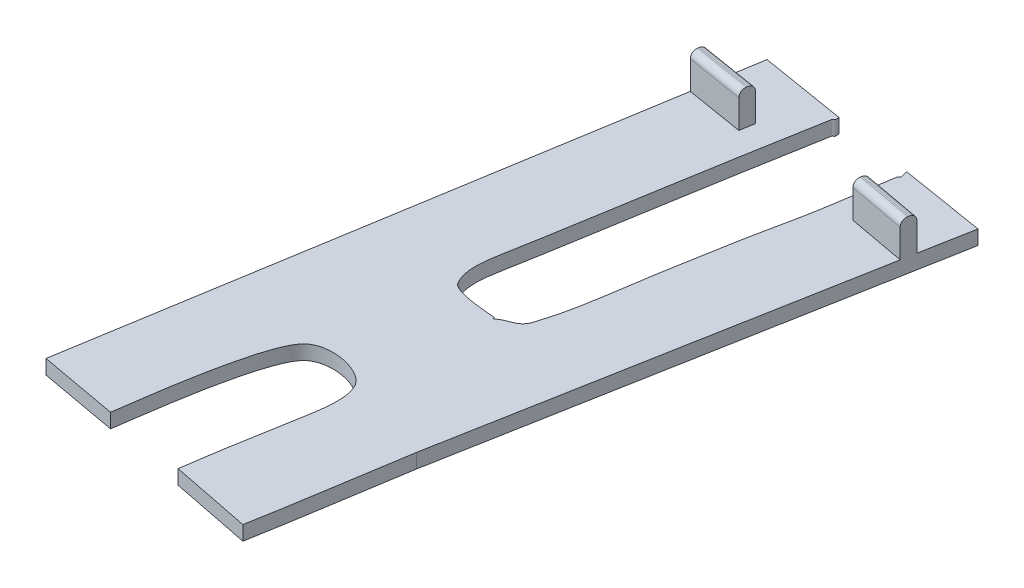
ISO-10303-21;
HEADER;
FILE_DESCRIPTION(('STEP AP214'),'2;1');
FILE_NAME('part.step','',(''),(''),'','','');
FILE_SCHEMA(('AUTOMOTIVE_DESIGN { 1 0 10303 214 1 1 1 1 }'));
ENDSEC;
DATA;
#1=APPLICATION_CONTEXT('core data for automotive mechanical design processes');
#2=APPLICATION_PROTOCOL_DEFINITION('international standard','automotive_design',2000,#1);
#3=PRODUCT_CONTEXT('',#1,'mechanical');
#4=PRODUCT('Part','Part','',(#3));
#5=PRODUCT_RELATED_PRODUCT_CATEGORY('part','',(#4));
#6=PRODUCT_DEFINITION_FORMATION('','',#4);
#7=PRODUCT_DEFINITION_CONTEXT('part definition',#1,'design');
#8=PRODUCT_DEFINITION('design','',#6,#7);
#9=PRODUCT_DEFINITION_SHAPE('','',#8);
#10=(LENGTH_UNIT() NAMED_UNIT(*) SI_UNIT(.MILLI.,.METRE.));
#11=(NAMED_UNIT(*) PLANE_ANGLE_UNIT() SI_UNIT($,.RADIAN.));
#12=(NAMED_UNIT(*) SI_UNIT($,.STERADIAN.) SOLID_ANGLE_UNIT());
#13=UNCERTAINTY_MEASURE_WITH_UNIT(LENGTH_MEASURE(1.E-05),#10,'distance_accuracy_value','');
#14=(GEOMETRIC_REPRESENTATION_CONTEXT(3) GLOBAL_UNCERTAINTY_ASSIGNED_CONTEXT((#13)) GLOBAL_UNIT_ASSIGNED_CONTEXT((#10,
#11,#12)) REPRESENTATION_CONTEXT('',''));
#15=CARTESIAN_POINT('',(0.,0.,0.));
#16=DIRECTION('',(0.,0.,1.));
#17=DIRECTION('',(1.,0.,0.));
#18=AXIS2_PLACEMENT_3D('',#15,#16,#17);
#19=CARTESIAN_POINT('',(62.4947593620138,1.,-34.1363669338565));
#20=DIRECTION('',(0.,1.,0.));
#21=DIRECTION('',(0.,0.,1.));
#22=AXIS2_PLACEMENT_3D('',#19,#20,#21);
#23=PLANE('',#22);
#24=DIRECTION('',(-0.983871023470173,0.,-0.178879314555246));
#25=VECTOR('',#24,1.);
#26=CARTESIAN_POINT('',(48.3176180526334,1.,18.5299036374429));
#27=LINE('',#26,#25);
#28=CARTESIAN_POINT('',(48.3176180526334,1.,18.5299036374429));
#29=VERTEX_POINT('',#28);
#30=CARTESIAN_POINT('',(42.8404891067724,1.,17.534097227665));
#31=VERTEX_POINT('',#30);
#32=EDGE_CURVE('E210',#29,#31,#27,.T.);
#33=ORIENTED_EDGE('',*,*,#32,.F.);
#34=CARTESIAN_POINT('',(54.0535774989014,1.,19.5728053549462));
#35=CARTESIAN_POINT('',(54.2273944518186,1.,18.4429951609843));
#36=CARTESIAN_POINT('',(54.3668816625848,1.,17.307366926429));
#37=CARTESIAN_POINT('',(54.575028357653,1.,16.1833747730606));
#38=CARTESIAN_POINT('',(54.807877915917,1.,14.9259871584352));
#39=CARTESIAN_POINT('',(55.0095707399461,1.,13.663028955761));
#40=CARTESIAN_POINT('',(55.2268419310926,1.,12.4028560471112));
#41=CARTESIAN_POINT('',(55.3933544876438,1.,11.437083219114));
#42=CARTESIAN_POINT('',(55.8006028470478,1.,9.63949643838447));
#43=CARTESIAN_POINT('',(55.2268419310926,1.,8.49197460647397));
#44=CARTESIAN_POINT('',(54.6235165071106,1.,7.28532375851014));
#45=CARTESIAN_POINT('',(51.7213412108256,1.,6.64852043130625));
#46=CARTESIAN_POINT('',(50.7945096317037,1.,7.84016103303442));
#47=CARTESIAN_POINT('',(49.3931984092304,1.,9.64184689050008));
#48=CARTESIAN_POINT('',(48.4682347935097,1.,17.6073760995754));
#49=CARTESIAN_POINT('',(48.3176180526334,1.,18.5299036374429));
#50=B_SPLINE_CURVE_WITH_KNOTS('',3,(#34,#35,#36,#37,#38,#39,#40,#41,#42,#43,#44,#45,#46,#47,#48,
#49),.UNSPECIFIED.,.F.,.F.,(4,3,3,3,3,4),(0.,1.,2.,3.,4.,5.),.UNSPECIFIED.);
#51=CARTESIAN_POINT('',(54.0535774989014,1.,19.5728053549462));
#52=VERTEX_POINT('',#51);
#53=EDGE_CURVE('E496',#52,#29,#50,.T.);
#54=ORIENTED_EDGE('',*,*,#53,.F.);
#55=DIRECTION('',(-0.980765077971824,0.,-0.195191859028296));
#56=VECTOR('',#55,1.);
#57=CARTESIAN_POINT('',(59.6663397415668,1.,20.6898572576253));
#58=LINE('',#57,#56);
#59=CARTESIAN_POINT('',(59.6663397415668,1.,20.6898572576253));
#60=VERTEX_POINT('',#59);
#61=EDGE_CURVE('E572',#60,#52,#58,.T.);
#62=ORIENTED_EDGE('',*,*,#61,.F.);
#63=CARTESIAN_POINT('',(56.5304690779717,1.,35.6074192615589));
#64=CARTESIAN_POINT('',(57.3126453660991,1.,31.9572632502975));
#65=CARTESIAN_POINT('',(58.0716806454936,1.,28.30207162409));
#66=CARTESIAN_POINT('',(58.876997942354,1.,24.6569512277746));
#67=CARTESIAN_POINT('',(59.9234402604844,1.,19.9204228404476));
#68=CARTESIAN_POINT('',(60.5564316908162,1.,15.1017995957529));
#69=CARTESIAN_POINT('',(61.3538895214243,1.,10.3170526121047));
#70=B_SPLINE_CURVE_WITH_KNOTS('',3,(#63,#64,#65,#66,#67,#68,#69),.UNSPECIFIED.,.F.,.F.,(4,3,4),
(0.,1.,2.),.UNSPECIFIED.);
#71=CARTESIAN_POINT('',(61.3538895214243,1.,10.3170526121047));
#72=VERTEX_POINT('',#71);
#73=EDGE_CURVE('E241',#60,#72,#70,.T.);
#74=ORIENTED_EDGE('',*,*,#73,.T.);
#75=DIRECTION('',(0.180794289096554,0.,-0.983520932685254));
#76=VECTOR('',#75,1.);
#77=CARTESIAN_POINT('',(67.8720252558197,1.,-25.1416057830064));
#78=LINE('',#77,#76);
#79=CARTESIAN_POINT('',(66.5683316358789,1.,-18.0495124905286));
#80=VERTEX_POINT('',#79);
#81=EDGE_CURVE('E235',#72,#80,#78,.T.);
#82=ORIENTED_EDGE('',*,*,#81,.T.);
#83=DIRECTION('',(0.983520932685254,0.,0.180794289096554));
#84=VECTOR('',#83,1.);
#85=CARTESIAN_POINT('',(62.5457310211962,1.,-18.7889611329335));
#86=LINE('',#85,#84);
#87=CARTESIAN_POINT('',(62.5457310211962,1.,-18.7889611329335));
#88=VERTEX_POINT('',#87);
#89=EDGE_CURVE('E601',#88,#80,#86,.T.);
#90=ORIENTED_EDGE('',*,*,#89,.F.);
#91=DIRECTION('',(-0.180794289096536,0.,0.983520932685257));
#92=VECTOR('',#91,1.);
#93=CARTESIAN_POINT('',(62.7265253102928,1.,-19.7724820656188));
#94=LINE('',#93,#92);
#95=CARTESIAN_POINT('',(62.7265253102928,1.,-19.7724820656188));
#96=VERTEX_POINT('',#95);
#97=EDGE_CURVE('E612',#96,#88,#94,.T.);
#98=ORIENTED_EDGE('',*,*,#97,.F.);
#99=DIRECTION('',(-0.983520932685254,0.,-0.180794289096554));
#100=VECTOR('',#99,1.);
#101=CARTESIAN_POINT('',(66.7491259249755,1.,-19.0330334232139));
#102=LINE('',#101,#100);
#103=CARTESIAN_POINT('',(66.7491259249755,1.,-19.0330334232139));
#104=VERTEX_POINT('',#103);
#105=EDGE_CURVE('E606',#104,#96,#102,.T.);
#106=ORIENTED_EDGE('',*,*,#105,.F.);
#107=CARTESIAN_POINT('',(67.4072171372869,1.,-22.6130496181882));
#108=VERTEX_POINT('',#107);
#109=EDGE_CURVE('E228',#104,#108,#78,.T.);
#110=ORIENTED_EDGE('',*,*,#109,.T.);
#111=DIRECTION('',(0.98700726993051,0.,0.160675602081712));
#112=VECTOR('',#111,1.);
#113=CARTESIAN_POINT('',(61.4842522361122,1.,-23.5772532067515));
#114=LINE('',#113,#112);
#115=CARTESIAN_POINT('',(61.4842522361122,1.,-23.5772532067515));
#116=VERTEX_POINT('',#115);
#117=EDGE_CURVE('E11',#116,#108,#114,.T.);
#118=ORIENTED_EDGE('',*,*,#117,.F.);
#119=DIRECTION('',(-0.242535625036331,0.,-0.970142500145332));
#120=VECTOR('',#119,1.);
#121=CARTESIAN_POINT('',(61.4842522361122,1.,-23.5772532067515));
#122=LINE('',#121,#120);
#123=CARTESIAN_POINT('',(61.6146149508001,1.,-23.0558023479999));
#124=VERTEX_POINT('',#123);
#125=EDGE_CURVE('E525',#124,#116,#122,.T.);
#126=ORIENTED_EDGE('',*,*,#125,.F.);
#127=CARTESIAN_POINT('',(56.00901821922,1.,-0.37268999230381));
#128=CARTESIAN_POINT('',(56.503410012076,1.,-0.867081785159792));
#129=CARTESIAN_POINT('',(57.2883646958625,1.,-0.690936125657848));
#130=CARTESIAN_POINT('',(57.5733707954749,1.,-1.54595442449498));
#131=CARTESIAN_POINT('',(58.3671249376322,1.,-3.92721685096674));
#132=CARTESIAN_POINT('',(58.5651143191501,1.,-6.4705665803189));
#133=CARTESIAN_POINT('',(59.0073606570419,1.,-8.97662916170577));
#134=CARTESIAN_POINT('',(59.2680860864177,1.,-10.4540732615021));
#135=CARTESIAN_POINT('',(59.5288115157935,1.,-11.9315173612984));
#136=CARTESIAN_POINT('',(59.7895369451694,1.,-13.4089614610947));
#137=CARTESIAN_POINT('',(60.0077012263907,1.,-14.6452257213488));
#138=CARTESIAN_POINT('',(60.4798535062202,1.,-16.7335600139118));
#139=CARTESIAN_POINT('',(60.7020759479847,1.,-17.9716564751715));
#140=CARTESIAN_POINT('',(60.9974084280887,1.,-19.6170802928936));
#141=CARTESIAN_POINT('',(61.1889197560082,1.,-21.2800158155898));
#142=CARTESIAN_POINT('',(61.4842522361122,1.,-22.925439633312));
#143=CARTESIAN_POINT('',(61.4951088739998,1.,-22.9859266158285));
#144=CARTESIAN_POINT('',(61.5711607125708,1.,-23.0123481097706));
#145=CARTESIAN_POINT('',(61.6146149508001,1.,-23.0558023479999));
#146=B_SPLINE_CURVE_WITH_KNOTS('',3,(#127,#128,#129,#130,#131,#132,#133,#134,#135,#136,#137,
#138,#139,#140,#141,#142,#143,#144,#145),.UNSPECIFIED.,.F.,.F.,(4,3,3,3,3,3,4),(0.,1.,2.,3.,4.,
5.,6.),.UNSPECIFIED.);
#147=CARTESIAN_POINT('',(56.00901821922,1.,-0.37268999230381));
#148=VERTEX_POINT('',#147);
#149=EDGE_CURVE('E515',#148,#124,#146,.T.);
#150=ORIENTED_EDGE('',*,*,#149,.F.);
#151=CARTESIAN_POINT('',(55.8786555045321,1.,-24.4897922095669));
#152=CARTESIAN_POINT('',(55.8786555045321,1.,-24.4028837331083));
#153=CARTESIAN_POINT('',(55.9061383778905,1.,-24.3115154002664));
#154=CARTESIAN_POINT('',(55.8786555045321,1.,-24.2290667801911));
#155=CARTESIAN_POINT('',(55.8592221784139,1.,-24.1707668018363));
#156=CARTESIAN_POINT('',(55.758972519556,1.,-24.1592225338699));
#157=CARTESIAN_POINT('',(55.7482927898442,1.,-24.0987040655031));
#158=CARTESIAN_POINT('',(55.4875673604684,1.,-22.6212599657069));
#159=CARTESIAN_POINT('',(55.2268419310926,1.,-21.1438158659106));
#160=CARTESIAN_POINT('',(54.9661165017167,1.,-19.6663717661143));
#161=CARTESIAN_POINT('',(54.1037909505302,1.,-14.7798603093902));
#162=CARTESIAN_POINT('',(53.3605685197834,1.,-9.96705545496349));
#163=CARTESIAN_POINT('',(52.4892249226465,1.,-5.06574772106851));
#164=CARTESIAN_POINT('',(52.2987384053662,1.,-3.99426106136671));
#165=CARTESIAN_POINT('',(51.9043416754849,1.,-2.40918693516841));
#166=CARTESIAN_POINT('',(52.6195876373344,1.,-1.28522899511916));
#167=CARTESIAN_POINT('',(53.0297271053237,1.,-0.64072411685034));
#168=CARTESIAN_POINT('',(55.553569248974,1.,-0.546397541066134));
#169=CARTESIAN_POINT('',(55.8786555045321,1.,-0.503052706991718));
#170=CARTESIAN_POINT('',(55.9395700007324,1.,-0.494930774165013));
#171=CARTESIAN_POINT('',(55.9655639809907,1.,-0.416144230533108));
#172=CARTESIAN_POINT('',(56.00901821922,1.,-0.37268999230381));
#173=B_SPLINE_CURVE_WITH_KNOTS('',3,(#151,#152,#153,#154,#155,#156,#157,#158,#159,#160,#161,
#162,#163,#164,#165,#166,#167,#168,#169,#170,#171,#172),.UNSPECIFIED.,.F.,.F.,(4,3,3,3,3,3,3,4),
(0.,1.,2.,3.,4.,5.,6.,7.),.UNSPECIFIED.);
#174=CARTESIAN_POINT('',(55.8786555045321,1.,-24.4897922095669));
#175=VERTEX_POINT('',#174);
#176=EDGE_CURVE('E219',#175,#148,#173,.T.);
#177=ORIENTED_EDGE('',*,*,#176,.F.);
#178=DIRECTION('',(0.986789091699309,0.,0.162010149383468));
#179=VECTOR('',#178,1.);
#180=CARTESIAN_POINT('',(55.8786555045321,1.,-24.4897922095669));
#181=LINE('',#180,#179);
#182=CARTESIAN_POINT('',(49.9010584450303,1.,-25.4711887417239));
#183=VERTEX_POINT('',#182);
#184=EDGE_CURVE('E202',#183,#175,#181,.T.);
#185=ORIENTED_EDGE('',*,*,#184,.F.);
#186=DIRECTION('',(-0.162010149383469,0.,0.986789091699308));
#187=VECTOR('',#186,1.);
#188=CARTESIAN_POINT('',(40.365492456671,1.,32.609076823737));
#189=LINE('',#188,#187);
#190=CARTESIAN_POINT('',(49.3113415012744,1.,-21.8792764479384));
#191=VERTEX_POINT('',#190);
#192=EDGE_CURVE('E216',#183,#191,#189,.T.);
#193=ORIENTED_EDGE('',*,*,#192,.T.);
#194=DIRECTION('',(-0.986789091699309,0.,-0.162010149383468));
#195=VECTOR('',#194,1.);
#196=CARTESIAN_POINT('',(49.3113415012744,1.,-21.8792764479384));
#197=LINE('',#196,#195);
#198=CARTESIAN_POINT('',(53.3473088863246,1.,-21.21665493696));
#199=VERTEX_POINT('',#198);
#200=EDGE_CURVE('E639',#199,#191,#197,.T.);
#201=ORIENTED_EDGE('',*,*,#200,.F.);
#202=DIRECTION('',(0.162010149383468,0.,-0.986789091699309));
#203=VECTOR('',#202,1.);
#204=CARTESIAN_POINT('',(53.3473088863246,1.,-21.21665493696));
#205=LINE('',#204,#203);
#206=CARTESIAN_POINT('',(53.1852987369411,1.,-20.2298658452607));
#207=VERTEX_POINT('',#206);
#208=EDGE_CURVE('E649',#207,#199,#205,.T.);
#209=ORIENTED_EDGE('',*,*,#208,.F.);
#210=DIRECTION('',(0.986789091699309,0.,0.162010149383468));
#211=VECTOR('',#210,1.);
#212=CARTESIAN_POINT('',(53.1852987369411,1.,-20.2298658452607));
#213=LINE('',#212,#211);
#214=CARTESIAN_POINT('',(49.149331351891,1.,-20.8924873562391));
#215=VERTEX_POINT('',#214);
#216=EDGE_CURVE('E645',#215,#207,#213,.T.);
#217=ORIENTED_EDGE('',*,*,#216,.F.);
#218=EDGE_CURVE('E227',#215,#31,#189,.T.);
#219=ORIENTED_EDGE('',*,*,#218,.T.);
#220=EDGE_LOOP('',(#33,#54,#62,#74,#82,#90,#98,#106,#110,#118,#126,#150,#177,#185,#193,#201,
#209,#217,#219));
#221=FACE_BOUND('',#220,.T.);
#222=ADVANCED_FACE('F38',(#221),#23,.T.);
#223=CARTESIAN_POINT('',(62.4947593620138,0.,-34.1363669338565));
#224=DIRECTION('',(0.,1.,0.));
#225=DIRECTION('',(0.,0.,1.));
#226=AXIS2_PLACEMENT_3D('',#223,#224,#225);
#227=PLANE('',#226);
#228=DIRECTION('',(-0.242535625036331,0.,-0.970142500145332));
#229=VECTOR('',#228,1.);
#230=CARTESIAN_POINT('',(61.4842522361122,0.,-23.5772532067515));
#231=LINE('',#230,#229);
#232=CARTESIAN_POINT('',(61.6146149508001,0.,-23.0558023479999));
#233=VERTEX_POINT('',#232);
#234=CARTESIAN_POINT('',(61.4842522361122,0.,-23.5772532067515));
#235=VERTEX_POINT('',#234);
#236=EDGE_CURVE('E233',#233,#235,#231,.T.);
#237=ORIENTED_EDGE('',*,*,#236,.T.);
#238=DIRECTION('',(0.987007269930511,0.,0.160675602081712));
#239=VECTOR('',#238,1.);
#240=CARTESIAN_POINT('',(60.7941228598916,0.,-23.6895998493921));
#241=LINE('',#240,#239);
#242=CARTESIAN_POINT('',(67.4072171372869,0.,-22.6130496181882));
#243=VERTEX_POINT('',#242);
#244=EDGE_CURVE('E58',#235,#243,#241,.T.);
#245=ORIENTED_EDGE('',*,*,#244,.T.);
#246=DIRECTION('',(0.180794289096554,0.,-0.983520932685254));
#247=VECTOR('',#246,1.);
#248=CARTESIAN_POINT('',(67.8720252558197,0.,-25.1416057830064));
#249=LINE('',#248,#247);
#250=CARTESIAN_POINT('',(61.3538895214243,0.,10.3170526121047));
#251=VERTEX_POINT('',#250);
#252=EDGE_CURVE('E42',#251,#243,#249,.T.);
#253=ORIENTED_EDGE('',*,*,#252,.F.);
#254=CARTESIAN_POINT('',(56.5304690779717,0.,35.6074192615589));
#255=CARTESIAN_POINT('',(57.3126453660991,0.,31.9572632502975));
#256=CARTESIAN_POINT('',(58.0716806454936,0.,28.30207162409));
#257=CARTESIAN_POINT('',(58.876997942354,0.,24.6569512277746));
#258=CARTESIAN_POINT('',(59.9234402604844,0.,19.9204228404476));
#259=CARTESIAN_POINT('',(60.5564316908162,0.,15.1017995957529));
#260=CARTESIAN_POINT('',(61.3538895214243,0.,10.3170526121047));
#261=B_SPLINE_CURVE_WITH_KNOTS('',3,(#254,#255,#256,#257,#258,#259,#260),.UNSPECIFIED.,.F.,.F.,
(4,3,4),(0.,1.,2.),.UNSPECIFIED.);
#262=CARTESIAN_POINT('',(59.6663397415668,0.,20.6898572576253));
#263=VERTEX_POINT('',#262);
#264=EDGE_CURVE('E660',#263,#251,#261,.T.);
#265=ORIENTED_EDGE('',*,*,#264,.F.);
#266=DIRECTION('',(-0.980765077971824,0.,-0.195191859028296));
#267=VECTOR('',#266,1.);
#268=CARTESIAN_POINT('',(51.8912094109234,0.,19.1424508730465));
#269=LINE('',#268,#267);
#270=CARTESIAN_POINT('',(54.0535774989014,0.,19.5728053549462));
#271=VERTEX_POINT('',#270);
#272=EDGE_CURVE('E584',#263,#271,#269,.T.);
#273=ORIENTED_EDGE('',*,*,#272,.T.);
#274=CARTESIAN_POINT('',(54.0535774989014,0.,19.5728053549462));
#275=CARTESIAN_POINT('',(54.2273944518186,0.,18.4429951609843));
#276=CARTESIAN_POINT('',(54.3668816625848,0.,17.307366926429));
#277=CARTESIAN_POINT('',(54.575028357653,0.,16.1833747730606));
#278=CARTESIAN_POINT('',(54.807877915917,0.,14.9259871584352));
#279=CARTESIAN_POINT('',(55.0095707399461,0.,13.663028955761));
#280=CARTESIAN_POINT('',(55.2268419310926,0.,12.4028560471112));
#281=CARTESIAN_POINT('',(55.3933544876438,0.,11.437083219114));
#282=CARTESIAN_POINT('',(55.8006028470478,0.,9.63949643838447));
#283=CARTESIAN_POINT('',(55.2268419310926,0.,8.49197460647397));
#284=CARTESIAN_POINT('',(54.6235165071106,0.,7.28532375851014));
#285=CARTESIAN_POINT('',(51.7213412108256,0.,6.64852043130625));
#286=CARTESIAN_POINT('',(50.7945096317037,0.,7.84016103303442));
#287=CARTESIAN_POINT('',(49.3931984092304,0.,9.64184689050008));
#288=CARTESIAN_POINT('',(48.4682347935097,0.,17.6073760995754));
#289=CARTESIAN_POINT('',(48.3176180526334,0.,18.5299036374429));
#290=B_SPLINE_CURVE_WITH_KNOTS('',3,(#274,#275,#276,#277,#278,#279,#280,#281,#282,#283,#284,
#285,#286,#287,#288,#289),.UNSPECIFIED.,.F.,.F.,(4,3,3,3,3,4),(0.,1.,2.,3.,4.,5.),.UNSPECIFIED.);
#291=CARTESIAN_POINT('',(48.3176180526334,0.,18.5299036374429));
#292=VERTEX_POINT('',#291);
#293=EDGE_CURVE('E588',#271,#292,#290,.T.);
#294=ORIENTED_EDGE('',*,*,#293,.T.);
#295=DIRECTION('',(-0.983871023470173,0.,-0.178879314555246));
#296=VECTOR('',#295,1.);
#297=CARTESIAN_POINT('',(52.7721650976556,0.,19.3397926402283));
#298=LINE('',#297,#296);
#299=CARTESIAN_POINT('',(42.8404891067724,0.,17.534097227665));
#300=VERTEX_POINT('',#299);
#301=EDGE_CURVE('E558',#292,#300,#298,.T.);
#302=ORIENTED_EDGE('',*,*,#301,.T.);
#303=DIRECTION('',(-0.162010149383469,0.,0.986789091699308));
#304=VECTOR('',#303,1.);
#305=CARTESIAN_POINT('',(40.365492456671,0.,32.609076823737));
#306=LINE('',#305,#304);
#307=CARTESIAN_POINT('',(49.9010584450303,0.,-25.4711887417239));
#308=VERTEX_POINT('',#307);
#309=EDGE_CURVE('E538',#308,#300,#306,.T.);
#310=ORIENTED_EDGE('',*,*,#309,.F.);
#311=DIRECTION('',(0.986789091699309,0.,0.162010149383468));
#312=VECTOR('',#311,1.);
#313=CARTESIAN_POINT('',(60.7789081388995,0.,-23.6852731203424));
#314=LINE('',#313,#312);
#315=CARTESIAN_POINT('',(55.8786555045321,0.,-24.4897922095669));
#316=VERTEX_POINT('',#315);
#317=EDGE_CURVE('E74',#308,#316,#314,.T.);
#318=ORIENTED_EDGE('',*,*,#317,.T.);
#319=CARTESIAN_POINT('',(55.8786555045321,0.,-24.4897922095669));
#320=CARTESIAN_POINT('',(55.8786555045321,0.,-24.4028837331083));
#321=CARTESIAN_POINT('',(55.9061383778905,0.,-24.3115154002664));
#322=CARTESIAN_POINT('',(55.8786555045321,0.,-24.2290667801911));
#323=CARTESIAN_POINT('',(55.8592221784139,0.,-24.1707668018363));
#324=CARTESIAN_POINT('',(55.758972519556,0.,-24.1592225338699));
#325=CARTESIAN_POINT('',(55.7482927898442,0.,-24.0987040655031));
#326=CARTESIAN_POINT('',(55.4875673604684,0.,-22.6212599657069));
#327=CARTESIAN_POINT('',(55.2268419310926,0.,-21.1438158659106));
#328=CARTESIAN_POINT('',(54.9661165017167,0.,-19.6663717661143));
#329=CARTESIAN_POINT('',(54.1037909505302,0.,-14.7798603093902));
#330=CARTESIAN_POINT('',(53.3605685197834,0.,-9.96705545496349));
#331=CARTESIAN_POINT('',(52.4892249226465,0.,-5.06574772106851));
#332=CARTESIAN_POINT('',(52.2987384053662,0.,-3.99426106136671));
#333=CARTESIAN_POINT('',(51.9043416754849,0.,-2.40918693516841));
#334=CARTESIAN_POINT('',(52.6195876373344,0.,-1.28522899511916));
#335=CARTESIAN_POINT('',(53.0297271053237,0.,-0.64072411685034));
#336=CARTESIAN_POINT('',(55.553569248974,0.,-0.546397541066134));
#337=CARTESIAN_POINT('',(55.8786555045321,0.,-0.503052706991718));
#338=CARTESIAN_POINT('',(55.9395700007324,0.,-0.494930774165013));
#339=CARTESIAN_POINT('',(55.9655639809907,0.,-0.416144230533108));
#340=CARTESIAN_POINT('',(56.00901821922,0.,-0.37268999230381));
#341=B_SPLINE_CURVE_WITH_KNOTS('',3,(#319,#320,#321,#322,#323,#324,#325,#326,#327,#328,#329,
#330,#331,#332,#333,#334,#335,#336,#337,#338,#339,#340),.UNSPECIFIED.,.F.,.F.,(4,3,3,3,3,3,3,4),
(0.,1.,2.,3.,4.,5.,6.,7.),.UNSPECIFIED.);
#342=CARTESIAN_POINT('',(56.00901821922,0.,-0.37268999230381));
#343=VERTEX_POINT('',#342);
#344=EDGE_CURVE('E539',#316,#343,#341,.T.);
#345=ORIENTED_EDGE('',*,*,#344,.T.);
#346=CARTESIAN_POINT('',(56.00901821922,0.,-0.37268999230381));
#347=CARTESIAN_POINT('',(56.503410012076,0.,-0.867081785159792));
#348=CARTESIAN_POINT('',(57.2883646958625,0.,-0.690936125657848));
#349=CARTESIAN_POINT('',(57.5733707954749,0.,-1.54595442449498));
#350=CARTESIAN_POINT('',(58.3671249376322,0.,-3.92721685096674));
#351=CARTESIAN_POINT('',(58.5651143191501,0.,-6.4705665803189));
#352=CARTESIAN_POINT('',(59.0073606570419,0.,-8.97662916170577));
#353=CARTESIAN_POINT('',(59.2680860864177,0.,-10.4540732615021));
#354=CARTESIAN_POINT('',(59.5288115157935,0.,-11.9315173612984));
#355=CARTESIAN_POINT('',(59.7895369451694,0.,-13.4089614610947));
#356=CARTESIAN_POINT('',(60.0077012263907,0.,-14.6452257213488));
#357=CARTESIAN_POINT('',(60.4798535062202,0.,-16.7335600139118));
#358=CARTESIAN_POINT('',(60.7020759479847,0.,-17.9716564751715));
#359=CARTESIAN_POINT('',(60.9974084280887,0.,-19.6170802928936));
#360=CARTESIAN_POINT('',(61.1889197560082,0.,-21.2800158155898));
#361=CARTESIAN_POINT('',(61.4842522361122,0.,-22.925439633312));
#362=CARTESIAN_POINT('',(61.4951088739998,0.,-22.9859266158285));
#363=CARTESIAN_POINT('',(61.5711607125708,0.,-23.0123481097706));
#364=CARTESIAN_POINT('',(61.6146149508001,0.,-23.0558023479999));
#365=B_SPLINE_CURVE_WITH_KNOTS('',3,(#346,#347,#348,#349,#350,#351,#352,#353,#354,#355,#356,
#357,#358,#359,#360,#361,#362,#363,#364),.UNSPECIFIED.,.F.,.F.,(4,3,3,3,3,3,4),(0.,1.,2.,3.,4.,
5.,6.),.UNSPECIFIED.);
#366=EDGE_CURVE('E532',#343,#233,#365,.T.);
#367=ORIENTED_EDGE('',*,*,#366,.T.);
#368=EDGE_LOOP('',(#237,#245,#253,#265,#273,#294,#302,#310,#318,#345,#367));
#369=FACE_BOUND('',#368,.T.);
#370=ADVANCED_FACE('F40',(#369),#227,.F.);
#371=CARTESIAN_POINT('',(40.365492456671,1.,32.609076823737));
#372=DIRECTION('',(0.986789091699309,0.,0.162010149383469));
#373=DIRECTION('',(0.162010149383469,0.,-0.986789091699309));
#374=AXIS2_PLACEMENT_3D('',#371,#372,#373);
#375=PLANE('',#374);
#376=ORIENTED_EDGE('',*,*,#192,.F.);
#377=DIRECTION('',(0.,1.,0.));
#378=VECTOR('',#377,1.);
#379=CARTESIAN_POINT('',(49.9010584450303,-9.,-25.4711887417239));
#380=LINE('',#379,#378);
#381=EDGE_CURVE('E204',#308,#183,#380,.T.);
#382=ORIENTED_EDGE('',*,*,#381,.F.);
#383=ORIENTED_EDGE('',*,*,#309,.T.);
#384=DIRECTION('',(0.,1.,0.));
#385=VECTOR('',#384,1.);
#386=CARTESIAN_POINT('',(42.8404891067724,-9.,17.534097227665));
#387=LINE('',#386,#385);
#388=EDGE_CURVE('E579',#300,#31,#387,.T.);
#389=ORIENTED_EDGE('',*,*,#388,.T.);
#390=ORIENTED_EDGE('',*,*,#218,.F.);
#391=DIRECTION('',(0.,-1.,0.));
#392=VECTOR('',#391,1.);
#393=CARTESIAN_POINT('',(49.149331351891,3.42,-20.8924873562391));
#394=LINE('',#393,#392);
#395=CARTESIAN_POINT('',(49.149331351891,2.97,-20.8924873562391));
#396=VERTEX_POINT('',#395);
#397=EDGE_CURVE('E181',#396,#215,#394,.T.);
#398=ORIENTED_EDGE('',*,*,#397,.F.);
#399=CARTESIAN_POINT('',(49.2222359191135,2.97,-21.3365424475038));
#400=DIRECTION('',(0.986789091699309,0.,0.162010149383469));
#401=DIRECTION('',(0.162010149383469,0.,-0.986789091699309));
#402=AXIS2_PLACEMENT_3D('',#399,#400,#401);
#403=CIRCLE('',#402,0.45);
#404=CARTESIAN_POINT('',(49.2222359191135,3.42,-21.3365424475038));
#405=VERTEX_POINT('',#404);
#406=EDGE_CURVE('E583',#396,#405,#403,.F.);
#407=ORIENTED_EDGE('',*,*,#406,.T.);
#408=DIRECTION('',(-0.162010149383468,0.,0.986789091699309));
#409=VECTOR('',#408,1.);
#410=CARTESIAN_POINT('',(49.3113415012744,3.42,-21.8792764479384));
#411=LINE('',#410,#409);
#412=CARTESIAN_POINT('',(49.2384369340519,3.42,-21.4352213566737));
#413=VERTEX_POINT('',#412);
#414=EDGE_CURVE('E634',#413,#405,#411,.T.);
#415=ORIENTED_EDGE('',*,*,#414,.F.);
#416=CARTESIAN_POINT('',(49.2384369340519,2.97,-21.4352213566737));
#417=DIRECTION('',(0.986789091699309,0.,0.162010149383469));
#418=DIRECTION('',(0.162010149383469,0.,-0.986789091699309));
#419=AXIS2_PLACEMENT_3D('',#416,#417,#418);
#420=CIRCLE('',#419,0.45);
#421=CARTESIAN_POINT('',(49.3113415012744,2.97,-21.8792764479384));
#422=VERTEX_POINT('',#421);
#423=EDGE_CURVE('E661',#413,#422,#420,.F.);
#424=ORIENTED_EDGE('',*,*,#423,.T.);
#425=DIRECTION('',(0.,-1.,0.));
#426=VECTOR('',#425,1.);
#427=CARTESIAN_POINT('',(49.3113415012744,3.42,-21.8792764479384));
#428=LINE('',#427,#426);
#429=EDGE_CURVE('E225',#422,#191,#428,.T.);
#430=ORIENTED_EDGE('',*,*,#429,.T.);
#431=EDGE_LOOP('',(#376,#382,#383,#389,#390,#398,#407,#415,#424,#430));
#432=FACE_BOUND('',#431,.T.);
#433=ADVANCED_FACE('F222',(#432),#375,.F.);
#434=DIRECTION('',(0.,-1.,0.));
#435=VECTOR('',#434,1.);
#436=SURFACE_OF_LINEAR_EXTRUSION('',#70,#435);
#437=ORIENTED_EDGE('',*,*,#73,.F.);
#438=DIRECTION('',(0.,1.,0.));
#439=VECTOR('',#438,1.);
#440=CARTESIAN_POINT('',(59.6663397415668,-9.,20.6898572576253));
#441=LINE('',#440,#439);
#442=EDGE_CURVE('E575',#263,#60,#441,.T.);
#443=ORIENTED_EDGE('',*,*,#442,.F.);
#444=ORIENTED_EDGE('',*,*,#264,.T.);
#445=DIRECTION('',(0.,-1.,0.));
#446=VECTOR('',#445,1.);
#447=CARTESIAN_POINT('',(61.3538895214243,1.,10.3170526121047));
#448=LINE('',#447,#446);
#449=EDGE_CURVE('E514',#72,#251,#448,.T.);
#450=ORIENTED_EDGE('',*,*,#449,.F.);
#451=EDGE_LOOP('',(#437,#443,#444,#450));
#452=FACE_BOUND('',#451,.T.);
#453=ADVANCED_FACE('F251',(#452),#436,.F.);
#454=CARTESIAN_POINT('',(67.8720252558197,1.,-25.1416057830064));
#455=DIRECTION('',(-0.983520932685254,0.,-0.180794289096554));
#456=DIRECTION('',(-0.180794289096554,0.,0.983520932685254));
#457=AXIS2_PLACEMENT_3D('',#454,#455,#456);
#458=PLANE('',#457);
#459=ORIENTED_EDGE('',*,*,#252,.T.);
#460=DIRECTION('',(0.,1.,0.));
#461=VECTOR('',#460,1.);
#462=CARTESIAN_POINT('',(67.4072171372869,-9.,-22.6130496181882));
#463=LINE('',#462,#461);
#464=EDGE_CURVE('E703',#243,#108,#463,.T.);
#465=ORIENTED_EDGE('',*,*,#464,.T.);
#466=ORIENTED_EDGE('',*,*,#109,.F.);
#467=DIRECTION('',(0.,-1.,0.));
#468=VECTOR('',#467,1.);
#469=CARTESIAN_POINT('',(66.7491259249755,3.42,-19.0330334232139));
#470=LINE('',#469,#468);
#471=CARTESIAN_POINT('',(66.7491259249755,2.97,-19.0330334232139));
#472=VERTEX_POINT('',#471);
#473=EDGE_CURVE('E611',#472,#104,#470,.T.);
#474=ORIENTED_EDGE('',*,*,#473,.F.);
#475=CARTESIAN_POINT('',(66.667768494882,2.97,-18.5904490035055));
#476=DIRECTION('',(-0.983520932685254,0.,-0.180794289096554));
#477=DIRECTION('',(-0.180794289096554,0.,0.983520932685254));
#478=AXIS2_PLACEMENT_3D('',#475,#476,#477);
#479=CIRCLE('',#478,0.45);
#480=CARTESIAN_POINT('',(66.667768494882,3.42,-18.5904490035055));
#481=VERTEX_POINT('',#480);
#482=EDGE_CURVE('E706',#472,#481,#479,.F.);
#483=ORIENTED_EDGE('',*,*,#482,.T.);
#484=DIRECTION('',(0.180794289096565,0.,-0.983520932685252));
#485=VECTOR('',#484,1.);
#486=CARTESIAN_POINT('',(66.5683316358789,3.42,-18.0495124905286));
#487=LINE('',#486,#485);
#488=CARTESIAN_POINT('',(66.6496890659724,3.42,-18.492096910237));
#489=VERTEX_POINT('',#488);
#490=EDGE_CURVE('E596',#489,#481,#487,.T.);
#491=ORIENTED_EDGE('',*,*,#490,.F.);
#492=CARTESIAN_POINT('',(66.6496890659724,2.97,-18.492096910237));
#493=DIRECTION('',(-0.983520932685254,0.,-0.180794289096554));
#494=DIRECTION('',(-0.180794289096554,0.,0.983520932685254));
#495=AXIS2_PLACEMENT_3D('',#492,#493,#494);
#496=CIRCLE('',#495,0.45);
#497=CARTESIAN_POINT('',(66.5683316358789,2.97,-18.0495124905286));
#498=VERTEX_POINT('',#497);
#499=EDGE_CURVE('E625',#489,#498,#496,.F.);
#500=ORIENTED_EDGE('',*,*,#499,.T.);
#501=DIRECTION('',(0.,-1.,0.));
#502=VECTOR('',#501,1.);
#503=CARTESIAN_POINT('',(66.5683316358789,3.42,-18.0495124905286));
#504=LINE('',#503,#502);
#505=EDGE_CURVE('E622',#498,#80,#504,.T.);
#506=ORIENTED_EDGE('',*,*,#505,.T.);
#507=ORIENTED_EDGE('',*,*,#81,.F.);
#508=ORIENTED_EDGE('',*,*,#449,.T.);
#509=EDGE_LOOP('',(#459,#465,#466,#474,#483,#491,#500,#506,#507,#508));
#510=FACE_BOUND('',#509,.T.);
#511=ADVANCED_FACE('F255',(#510),#458,.F.);
#512=DIRECTION('',(0.,-1.,0.));
#513=VECTOR('',#512,1.);
#514=SURFACE_OF_LINEAR_EXTRUSION('',#173,#513);
#515=ORIENTED_EDGE('',*,*,#344,.F.);
#516=DIRECTION('',(0.,-1.,0.));
#517=VECTOR('',#516,1.);
#518=CARTESIAN_POINT('',(55.8786555045321,1.,-24.4897922095669));
#519=LINE('',#518,#517);
#520=EDGE_CURVE('E49',#175,#316,#519,.T.);
#521=ORIENTED_EDGE('',*,*,#520,.F.);
#522=ORIENTED_EDGE('',*,*,#176,.T.);
#523=DIRECTION('',(0.,-1.,0.));
#524=VECTOR('',#523,1.);
#525=CARTESIAN_POINT('',(56.00901821922,1.,-0.37268999230381));
#526=LINE('',#525,#524);
#527=EDGE_CURVE('E239',#148,#343,#526,.T.);
#528=ORIENTED_EDGE('',*,*,#527,.T.);
#529=EDGE_LOOP('',(#515,#521,#522,#528));
#530=FACE_BOUND('',#529,.T.);
#531=ADVANCED_FACE('F283',(#530),#514,.T.);
#532=DIRECTION('',(0.,-1.,0.));
#533=VECTOR('',#532,1.);
#534=SURFACE_OF_LINEAR_EXTRUSION('',#146,#533);
#535=ORIENTED_EDGE('',*,*,#366,.F.);
#536=ORIENTED_EDGE('',*,*,#527,.F.);
#537=ORIENTED_EDGE('',*,*,#149,.T.);
#538=DIRECTION('',(0.,-1.,0.));
#539=VECTOR('',#538,1.);
#540=CARTESIAN_POINT('',(61.6146149508001,1.,-23.0558023479999));
#541=LINE('',#540,#539);
#542=EDGE_CURVE('E524',#124,#233,#541,.T.);
#543=ORIENTED_EDGE('',*,*,#542,.T.);
#544=EDGE_LOOP('',(#535,#536,#537,#543));
#545=FACE_BOUND('',#544,.T.);
#546=ADVANCED_FACE('F326',(#545),#534,.T.);
#547=CARTESIAN_POINT('',(61.4842522361122,1.,-23.5772532067515));
#548=DIRECTION('',(-0.970142500145332,0.,0.242535625036331));
#549=DIRECTION('',(0.242535625036331,0.,0.970142500145332));
#550=AXIS2_PLACEMENT_3D('',#547,#548,#549);
#551=PLANE('',#550);
#552=ORIENTED_EDGE('',*,*,#236,.F.);
#553=ORIENTED_EDGE('',*,*,#542,.F.);
#554=ORIENTED_EDGE('',*,*,#125,.T.);
#555=DIRECTION('',(0.,-1.,0.));
#556=VECTOR('',#555,1.);
#557=CARTESIAN_POINT('',(61.4842522361122,1.,-23.5772532067515));
#558=LINE('',#557,#556);
#559=EDGE_CURVE('E77',#116,#235,#558,.T.);
#560=ORIENTED_EDGE('',*,*,#559,.T.);
#561=EDGE_LOOP('',(#552,#553,#554,#560));
#562=FACE_BOUND('',#561,.T.);
#563=ADVANCED_FACE('F336',(#562),#551,.T.);
#564=DIRECTION('',(0.,-1.,0.));
#565=VECTOR('',#564,1.);
#566=SURFACE_OF_LINEAR_EXTRUSION('',#50,#565);
#567=ORIENTED_EDGE('',*,*,#293,.F.);
#568=DIRECTION('',(0.,-1.,0.));
#569=VECTOR('',#568,1.);
#570=CARTESIAN_POINT('',(54.0535774989014,1.,19.5728053549462));
#571=LINE('',#570,#569);
#572=EDGE_CURVE('E571',#52,#271,#571,.T.);
#573=ORIENTED_EDGE('',*,*,#572,.F.);
#574=ORIENTED_EDGE('',*,*,#53,.T.);
#575=DIRECTION('',(0.,-1.,0.));
#576=VECTOR('',#575,1.);
#577=CARTESIAN_POINT('',(48.3176180526334,1.,18.5299036374429));
#578=LINE('',#577,#576);
#579=EDGE_CURVE('E504',#29,#292,#578,.T.);
#580=ORIENTED_EDGE('',*,*,#579,.T.);
#581=EDGE_LOOP('',(#567,#573,#574,#580));
#582=FACE_BOUND('',#581,.T.);
#583=ADVANCED_FACE('F346',(#582),#566,.T.);
#584=CARTESIAN_POINT('',(53.1852987369411,3.42,-20.2298658452607));
#585=DIRECTION('',(0.162010149383468,0.,-0.986789091699308));
#586=DIRECTION('',(-0.986789091699309,0.,-0.162010149383468));
#587=AXIS2_PLACEMENT_3D('',#584,#585,#586);
#588=PLANE('',#587);
#589=DIRECTION('',(0.,-1.,0.));
#590=VECTOR('',#589,1.);
#591=CARTESIAN_POINT('',(53.1852987369411,3.42,-20.2298658452607));
#592=LINE('',#591,#590);
#593=CARTESIAN_POINT('',(53.1852987369411,2.97,-20.2298658452607));
#594=VERTEX_POINT('',#593);
#595=EDGE_CURVE('E654',#594,#207,#592,.T.);
#596=ORIENTED_EDGE('',*,*,#595,.F.);
#597=DIRECTION('',(0.986789091699309,0.,0.162010149383468));
#598=VECTOR('',#597,1.);
#599=CARTESIAN_POINT('',(53.1852987369411,2.97,-20.2298658452607));
#600=LINE('',#599,#598);
#601=EDGE_CURVE('E178',#594,#396,#600,.F.);
#602=ORIENTED_EDGE('',*,*,#601,.T.);
#603=ORIENTED_EDGE('',*,*,#397,.T.);
#604=ORIENTED_EDGE('',*,*,#216,.T.);
#605=EDGE_LOOP('',(#596,#602,#603,#604));
#606=FACE_BOUND('',#605,.T.);
#607=ADVANCED_FACE('F356',(#606),#588,.F.);
#608=CARTESIAN_POINT('',(53.3473088863246,3.42,-21.21665493696));
#609=DIRECTION('',(-0.986789091699309,0.,-0.162010149383468));
#610=DIRECTION('',(-0.162010149383468,0.,0.986789091699309));
#611=AXIS2_PLACEMENT_3D('',#608,#609,#610);
#612=PLANE('',#611);
#613=DIRECTION('',(0.162010149383468,0.,-0.986789091699309));
#614=VECTOR('',#613,1.);
#615=CARTESIAN_POINT('',(53.3473088863246,3.42,-21.21665493696));
#616=LINE('',#615,#614);
#617=CARTESIAN_POINT('',(53.2582033041637,3.42,-20.6739209365254));
#618=VERTEX_POINT('',#617);
#619=CARTESIAN_POINT('',(53.2744043191021,3.42,-20.7725998456953));
#620=VERTEX_POINT('',#619);
#621=EDGE_CURVE('E640',#618,#620,#616,.T.);
#622=ORIENTED_EDGE('',*,*,#621,.F.);
#623=CARTESIAN_POINT('',(53.2582033041637,2.97,-20.6739209365254));
#624=DIRECTION('',(-0.986789091699309,0.,-0.162010149383468));
#625=DIRECTION('',(-0.162010149383468,0.,0.986789091699309));
#626=AXIS2_PLACEMENT_3D('',#623,#624,#625);
#627=CIRCLE('',#626,0.45);
#628=EDGE_CURVE('E648',#618,#594,#627,.F.);
#629=ORIENTED_EDGE('',*,*,#628,.T.);
#630=ORIENTED_EDGE('',*,*,#595,.T.);
#631=ORIENTED_EDGE('',*,*,#208,.T.);
#632=DIRECTION('',(0.,-1.,0.));
#633=VECTOR('',#632,1.);
#634=CARTESIAN_POINT('',(53.3473088863246,3.42,-21.21665493696));
#635=LINE('',#634,#633);
#636=CARTESIAN_POINT('',(53.3473088863246,2.97,-21.21665493696));
#637=VERTEX_POINT('',#636);
#638=EDGE_CURVE('E657',#637,#199,#635,.T.);
#639=ORIENTED_EDGE('',*,*,#638,.F.);
#640=CARTESIAN_POINT('',(53.274404319102,2.97,-20.7725998456953));
#641=DIRECTION('',(-0.986789091699309,0.,-0.162010149383468));
#642=DIRECTION('',(-0.162010149383468,0.,0.986789091699309));
#643=AXIS2_PLACEMENT_3D('',#640,#641,#642);
#644=CIRCLE('',#643,0.45);
#645=EDGE_CURVE('E653',#637,#620,#644,.F.);
#646=ORIENTED_EDGE('',*,*,#645,.T.);
#647=EDGE_LOOP('',(#622,#629,#630,#631,#639,#646));
#648=FACE_BOUND('',#647,.T.);
#649=ADVANCED_FACE('F366',(#648),#612,.F.);
#650=CARTESIAN_POINT('',(49.3113415012744,3.42,-21.8792764479384));
#651=DIRECTION('',(-0.162010149383468,0.,0.986789091699308));
#652=DIRECTION('',(0.986789091699309,0.,0.162010149383468));
#653=AXIS2_PLACEMENT_3D('',#650,#651,#652);
#654=PLANE('',#653);
#655=ORIENTED_EDGE('',*,*,#429,.F.);
#656=DIRECTION('',(-0.986789091699309,0.,-0.162010149383468));
#657=VECTOR('',#656,1.);
#658=CARTESIAN_POINT('',(49.3113415012744,2.97,-21.8792764479384));
#659=LINE('',#658,#657);
#660=EDGE_CURVE('E663',#422,#637,#659,.F.);
#661=ORIENTED_EDGE('',*,*,#660,.T.);
#662=ORIENTED_EDGE('',*,*,#638,.T.);
#663=ORIENTED_EDGE('',*,*,#200,.T.);
#664=EDGE_LOOP('',(#655,#661,#662,#663));
#665=FACE_BOUND('',#664,.T.);
#666=ADVANCED_FACE('F375',(#665),#654,.F.);
#667=CARTESIAN_POINT('',(0.,3.42,0.));
#668=DIRECTION('',(0.,-1.,0.));
#669=DIRECTION('',(0.,0.,-1.));
#670=AXIS2_PLACEMENT_3D('',#667,#668,#669);
#671=PLANE('',#670);
#672=ORIENTED_EDGE('',*,*,#414,.T.);
#673=DIRECTION('',(0.986789091699309,0.,0.162010149383468));
#674=VECTOR('',#673,1.);
#675=CARTESIAN_POINT('',(4.70302002820455,3.42,-28.6456674445187));
#676=LINE('',#675,#674);
#677=EDGE_CURVE('E638',#405,#618,#676,.T.);
#678=ORIENTED_EDGE('',*,*,#677,.T.);
#679=ORIENTED_EDGE('',*,*,#621,.T.);
#680=DIRECTION('',(-0.986789091699309,0.,-0.162010149383468));
#681=VECTOR('',#680,1.);
#682=CARTESIAN_POINT('',(4.7192210431429,3.42,-28.7443463536886));
#683=LINE('',#682,#681);
#684=EDGE_CURVE('E644',#620,#413,#683,.T.);
#685=ORIENTED_EDGE('',*,*,#684,.T.);
#686=EDGE_LOOP('',(#672,#678,#679,#685));
#687=FACE_BOUND('',#686,.T.);
#688=ADVANCED_FACE('F385',(#687),#671,.F.);
#689=CARTESIAN_POINT('',(66.7491259249755,3.42,-19.0330334232139));
#690=DIRECTION('',(-0.180794289096554,0.,0.983520932685254));
#691=DIRECTION('',(0.983520932685254,0.,0.180794289096554));
#692=AXIS2_PLACEMENT_3D('',#689,#690,#691);
#693=PLANE('',#692);
#694=DIRECTION('',(0.,-1.,0.));
#695=VECTOR('',#694,1.);
#696=CARTESIAN_POINT('',(62.7265253102928,3.42,-19.7724820656188));
#697=LINE('',#696,#695);
#698=CARTESIAN_POINT('',(62.7265253102928,2.97,-19.7724820656188));
#699=VERTEX_POINT('',#698);
#700=EDGE_CURVE('E617',#699,#96,#697,.T.);
#701=ORIENTED_EDGE('',*,*,#700,.F.);
#702=DIRECTION('',(-0.983520932685254,0.,-0.180794289096554));
#703=VECTOR('',#702,1.);
#704=CARTESIAN_POINT('',(66.7491259249755,2.97,-19.0330334232138));
#705=LINE('',#704,#703);
#706=EDGE_CURVE('E633',#699,#472,#705,.F.);
#707=ORIENTED_EDGE('',*,*,#706,.T.);
#708=ORIENTED_EDGE('',*,*,#473,.T.);
#709=ORIENTED_EDGE('',*,*,#105,.T.);
#710=EDGE_LOOP('',(#701,#707,#708,#709));
#711=FACE_BOUND('',#710,.T.);
#712=ADVANCED_FACE('F395',(#711),#693,.F.);
#713=CARTESIAN_POINT('',(62.7265253102928,3.42,-19.7724820656188));
#714=DIRECTION('',(0.983520932685257,0.,0.180794289096536));
#715=DIRECTION('',(0.180794289096536,0.,-0.983520932685257));
#716=AXIS2_PLACEMENT_3D('',#713,#714,#715);
#717=PLANE('',#716);
#718=DIRECTION('',(-0.180794289096536,0.,0.983520932685257));
#719=VECTOR('',#718,1.);
#720=CARTESIAN_POINT('',(62.7265253102928,3.42,-19.7724820656188));
#721=LINE('',#720,#719);
#722=CARTESIAN_POINT('',(62.6451678801993,3.42,-19.3298976459104));
#723=VERTEX_POINT('',#722);
#724=CARTESIAN_POINT('',(62.6270884512897,3.42,-19.2315455526419));
#725=VERTEX_POINT('',#724);
#726=EDGE_CURVE('E602',#723,#725,#721,.T.);
#727=ORIENTED_EDGE('',*,*,#726,.F.);
#728=CARTESIAN_POINT('',(62.6451678801993,2.97,-19.3298976459104));
#729=DIRECTION('',(0.983520932685257,0.,0.180794289096536));
#730=DIRECTION('',(0.180794289096536,0.,-0.983520932685257));
#731=AXIS2_PLACEMENT_3D('',#728,#729,#730);
#732=CIRCLE('',#731,0.45);
#733=EDGE_CURVE('E610',#723,#699,#732,.F.);
#734=ORIENTED_EDGE('',*,*,#733,.T.);
#735=ORIENTED_EDGE('',*,*,#700,.T.);
#736=ORIENTED_EDGE('',*,*,#97,.T.);
#737=DIRECTION('',(0.,-1.,0.));
#738=VECTOR('',#737,1.);
#739=CARTESIAN_POINT('',(62.5457310211962,3.42,-18.7889611329335));
#740=LINE('',#739,#738);
#741=CARTESIAN_POINT('',(62.5457310211962,2.97,-18.7889611329335));
#742=VERTEX_POINT('',#741);
#743=EDGE_CURVE('E621',#742,#88,#740,.T.);
#744=ORIENTED_EDGE('',*,*,#743,.F.);
#745=CARTESIAN_POINT('',(62.6270884512897,2.97,-19.2315455526419));
#746=DIRECTION('',(0.983520932685257,0.,0.180794289096536));
#747=DIRECTION('',(0.180794289096536,0.,-0.983520932685257));
#748=AXIS2_PLACEMENT_3D('',#745,#746,#747);
#749=CIRCLE('',#748,0.45);
#750=EDGE_CURVE('E616',#742,#725,#749,.F.);
#751=ORIENTED_EDGE('',*,*,#750,.T.);
#752=EDGE_LOOP('',(#727,#734,#735,#736,#744,#751));
#753=FACE_BOUND('',#752,.T.);
#754=ADVANCED_FACE('F405',(#753),#717,.F.);
#755=CARTESIAN_POINT('',(62.5457310211962,3.42,-18.7889611329335));
#756=DIRECTION('',(0.180794289096554,0.,-0.983520932685254));
#757=DIRECTION('',(-0.983520932685254,0.,-0.180794289096554));
#758=AXIS2_PLACEMENT_3D('',#755,#756,#757);
#759=PLANE('',#758);
#760=ORIENTED_EDGE('',*,*,#505,.F.);
#761=DIRECTION('',(0.983520932685254,0.,0.180794289096554));
#762=VECTOR('',#761,1.);
#763=CARTESIAN_POINT('',(62.5457310211962,2.97,-18.7889611329335));
#764=LINE('',#763,#762);
#765=EDGE_CURVE('E628',#498,#742,#764,.F.);
#766=ORIENTED_EDGE('',*,*,#765,.T.);
#767=ORIENTED_EDGE('',*,*,#743,.T.);
#768=ORIENTED_EDGE('',*,*,#89,.T.);
#769=EDGE_LOOP('',(#760,#766,#767,#768));
#770=FACE_BOUND('',#769,.T.);
#771=ADVANCED_FACE('F415',(#770),#759,.F.);
#772=CARTESIAN_POINT('',(0.,3.42,0.));
#773=DIRECTION('',(0.,1.,0.));
#774=DIRECTION('',(0.,0.,1.));
#775=AXIS2_PLACEMENT_3D('',#772,#773,#774);
#776=PLANE('',#775);
#777=ORIENTED_EDGE('',*,*,#490,.T.);
#778=DIRECTION('',(-0.983520932685254,0.,-0.180794289096554));
#779=VECTOR('',#778,1.);
#780=CARTESIAN_POINT('',(62.6451678801993,3.42,-19.3298976459104));
#781=LINE('',#780,#779);
#782=EDGE_CURVE('E600',#481,#723,#781,.T.);
#783=ORIENTED_EDGE('',*,*,#782,.T.);
#784=ORIENTED_EDGE('',*,*,#726,.T.);
#785=DIRECTION('',(0.983520932685254,0.,0.180794289096554));
#786=VECTOR('',#785,1.);
#787=CARTESIAN_POINT('',(66.6496890659724,3.42,-18.492096910237));
#788=LINE('',#787,#786);
#789=EDGE_CURVE('E578',#725,#489,#788,.T.);
#790=ORIENTED_EDGE('',*,*,#789,.T.);
#791=EDGE_LOOP('',(#777,#783,#784,#790));
#792=FACE_BOUND('',#791,.T.);
#793=ADVANCED_FACE('F262',(#792),#776,.T.);
#794=CARTESIAN_POINT('',(5.48480110460855,2.97,-29.8373180090705));
#795=DIRECTION('',(0.983520932685254,0.,0.180794289096554));
#796=DIRECTION('',(0.180794289096554,0.,-0.983520932685254));
#797=AXIS2_PLACEMENT_3D('',#794,#795,#796);
#798=CYLINDRICAL_SURFACE('',#797,0.45);
#799=ORIENTED_EDGE('',*,*,#482,.F.);
#800=ORIENTED_EDGE('',*,*,#706,.F.);
#801=ORIENTED_EDGE('',*,*,#733,.F.);
#802=ORIENTED_EDGE('',*,*,#782,.F.);
#803=EDGE_LOOP('',(#799,#800,#801,#802));
#804=FACE_BOUND('',#803,.T.);
#805=ADVANCED_FACE('F258',(#804),#798,.T.);
#806=CARTESIAN_POINT('',(5.46672167569888,2.97,-29.7389659158019));
#807=DIRECTION('',(-0.983520932685254,0.,-0.180794289096554));
#808=DIRECTION('',(-0.180794289096554,0.,0.983520932685254));
#809=AXIS2_PLACEMENT_3D('',#806,#807,#808);
#810=CYLINDRICAL_SURFACE('',#809,0.45);
#811=ORIENTED_EDGE('',*,*,#750,.F.);
#812=ORIENTED_EDGE('',*,*,#765,.F.);
#813=ORIENTED_EDGE('',*,*,#499,.F.);
#814=ORIENTED_EDGE('',*,*,#789,.F.);
#815=EDGE_LOOP('',(#811,#812,#813,#814));
#816=FACE_BOUND('',#815,.T.);
#817=ADVANCED_FACE('F261',(#816),#810,.T.);
#818=CARTESIAN_POINT('',(4.70302002820455,2.97,-28.6456674445187));
#819=DIRECTION('',(0.986789091699309,0.,0.162010149383468));
#820=DIRECTION('',(0.162010149383468,0.,-0.986789091699309));
#821=AXIS2_PLACEMENT_3D('',#818,#819,#820);
#822=CYLINDRICAL_SURFACE('',#821,0.45);
#823=ORIENTED_EDGE('',*,*,#406,.F.);
#824=ORIENTED_EDGE('',*,*,#601,.F.);
#825=ORIENTED_EDGE('',*,*,#628,.F.);
#826=ORIENTED_EDGE('',*,*,#677,.F.);
#827=EDGE_LOOP('',(#823,#824,#825,#826));
#828=FACE_BOUND('',#827,.T.);
#829=ADVANCED_FACE('F266',(#828),#822,.T.);
#830=CARTESIAN_POINT('',(4.7192210431429,2.97,-28.7443463536886));
#831=DIRECTION('',(-0.986789091699309,0.,-0.162010149383468));
#832=DIRECTION('',(-0.162010149383468,0.,0.986789091699309));
#833=AXIS2_PLACEMENT_3D('',#830,#831,#832);
#834=CYLINDRICAL_SURFACE('',#833,0.45);
#835=ORIENTED_EDGE('',*,*,#645,.F.);
#836=ORIENTED_EDGE('',*,*,#660,.F.);
#837=ORIENTED_EDGE('',*,*,#423,.F.);
#838=ORIENTED_EDGE('',*,*,#684,.F.);
#839=EDGE_LOOP('',(#835,#836,#837,#838));
#840=FACE_BOUND('',#839,.T.);
#841=ADVANCED_FACE('F270',(#840),#834,.T.);
#842=CARTESIAN_POINT('',(59.6663397415668,-9.,20.6898572576253));
#843=DIRECTION('',(0.195191859028296,0.,-0.980765077971824));
#844=DIRECTION('',(-0.980765077971824,0.,-0.195191859028296));
#845=AXIS2_PLACEMENT_3D('',#842,#843,#844);
#846=PLANE('',#845);
#847=ORIENTED_EDGE('',*,*,#442,.T.);
#848=ORIENTED_EDGE('',*,*,#61,.T.);
#849=ORIENTED_EDGE('',*,*,#572,.T.);
#850=ORIENTED_EDGE('',*,*,#272,.F.);
#851=EDGE_LOOP('',(#847,#848,#849,#850));
#852=FACE_BOUND('',#851,.T.);
#853=ADVANCED_FACE('F274',(#852),#846,.F.);
#854=CARTESIAN_POINT('',(48.3176180526334,-9.,18.5299036374429));
#855=DIRECTION('',(0.178879314555246,0.,-0.983871023470173));
#856=DIRECTION('',(-0.983871023470173,0.,-0.178879314555246));
#857=AXIS2_PLACEMENT_3D('',#854,#855,#856);
#858=PLANE('',#857);
#859=ORIENTED_EDGE('',*,*,#579,.F.);
#860=ORIENTED_EDGE('',*,*,#32,.T.);
#861=ORIENTED_EDGE('',*,*,#388,.F.);
#862=ORIENTED_EDGE('',*,*,#301,.F.);
#863=EDGE_LOOP('',(#859,#860,#861,#862));
#864=FACE_BOUND('',#863,.T.);
#865=ADVANCED_FACE('F279',(#864),#858,.F.);
#866=CARTESIAN_POINT('',(49.9010584450303,-9.,-25.4711887417239));
#867=DIRECTION('',(-0.162010149383468,0.,0.986789091699309));
#868=DIRECTION('',(0.986789091699309,0.,0.162010149383468));
#869=AXIS2_PLACEMENT_3D('',#866,#867,#868);
#870=PLANE('',#869);
#871=ORIENTED_EDGE('',*,*,#381,.T.);
#872=ORIENTED_EDGE('',*,*,#184,.T.);
#873=ORIENTED_EDGE('',*,*,#520,.T.);
#874=ORIENTED_EDGE('',*,*,#317,.F.);
#875=EDGE_LOOP('',(#871,#872,#873,#874));
#876=FACE_BOUND('',#875,.T.);
#877=ADVANCED_FACE('F205',(#876),#870,.F.);
#878=CARTESIAN_POINT('',(61.4842522361122,-9.,-23.5772532067515));
#879=DIRECTION('',(-0.160675602081712,0.,0.98700726993051));
#880=DIRECTION('',(0.987007269930511,0.,0.160675602081712));
#881=AXIS2_PLACEMENT_3D('',#878,#879,#880);
#882=PLANE('',#881);
#883=ORIENTED_EDGE('',*,*,#559,.F.);
#884=ORIENTED_EDGE('',*,*,#117,.T.);
#885=ORIENTED_EDGE('',*,*,#464,.F.);
#886=ORIENTED_EDGE('',*,*,#244,.F.);
#887=EDGE_LOOP('',(#883,#884,#885,#886));
#888=FACE_BOUND('',#887,.T.);
#889=ADVANCED_FACE('F278',(#888),#882,.F.);
#890=CLOSED_SHELL('',(#222,#370,#433,#453,#511,#531,#546,#563,#583,#607,#649,#666,#688,#712,
#754,#771,#793,#805,#817,#829,#841,#853,#865,#877,#889));
#891=MANIFOLD_SOLID_BREP('B2',#890);
#892=ADVANCED_BREP_SHAPE_REPRESENTATION('',(#18,#891),#14);
#893=SHAPE_DEFINITION_REPRESENTATION(#9,#892);
ENDSEC;
END-ISO-10303-21;
